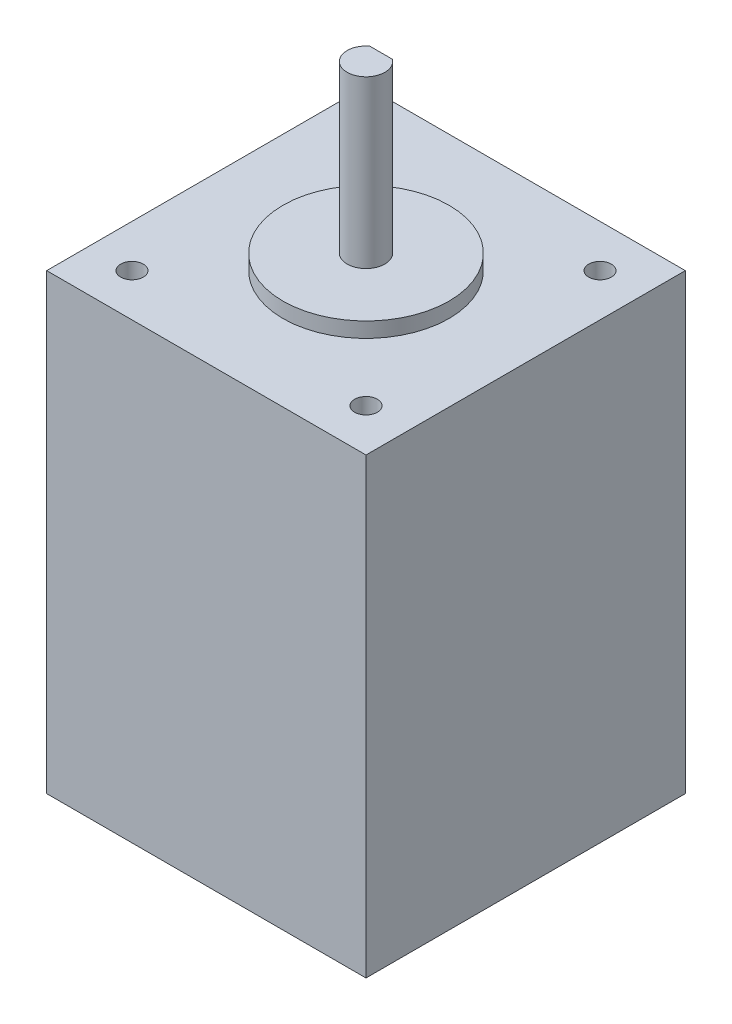
ISO-10303-21;
HEADER;
FILE_DESCRIPTION(('STEP AP214'),'2;1');
FILE_NAME('part.step','',(''),(''),'','','');
FILE_SCHEMA(('AUTOMOTIVE_DESIGN { 1 0 10303 214 1 1 1 1 }'));
ENDSEC;
DATA;
#1=APPLICATION_CONTEXT('core data for automotive mechanical design processes');
#2=APPLICATION_PROTOCOL_DEFINITION('international standard','automotive_design',2000,#1);
#3=PRODUCT_CONTEXT('',#1,'mechanical');
#4=PRODUCT('Part','Part','',(#3));
#5=PRODUCT_RELATED_PRODUCT_CATEGORY('part','',(#4));
#6=PRODUCT_DEFINITION_FORMATION('','',#4);
#7=PRODUCT_DEFINITION_CONTEXT('part definition',#1,'design');
#8=PRODUCT_DEFINITION('design','',#6,#7);
#9=PRODUCT_DEFINITION_SHAPE('','',#8);
#10=(LENGTH_UNIT() NAMED_UNIT(*) SI_UNIT(.MILLI.,.METRE.));
#11=(NAMED_UNIT(*) PLANE_ANGLE_UNIT() SI_UNIT($,.RADIAN.));
#12=(NAMED_UNIT(*) SI_UNIT($,.STERADIAN.) SOLID_ANGLE_UNIT());
#13=UNCERTAINTY_MEASURE_WITH_UNIT(LENGTH_MEASURE(1.E-05),#10,'distance_accuracy_value','');
#14=(GEOMETRIC_REPRESENTATION_CONTEXT(3) GLOBAL_UNCERTAINTY_ASSIGNED_CONTEXT((#13)) GLOBAL_UNIT_ASSIGNED_CONTEXT((#10,
#11,#12)) REPRESENTATION_CONTEXT('',''));
#15=CARTESIAN_POINT('',(0.,0.,0.));
#16=DIRECTION('',(0.,0.,1.));
#17=DIRECTION('',(1.,0.,0.));
#18=AXIS2_PLACEMENT_3D('',#15,#16,#17);
#19=CARTESIAN_POINT('',(0.,60.,0.));
#20=DIRECTION('',(0.,-1.,0.));
#21=DIRECTION('',(0.,0.,-1.));
#22=AXIS2_PLACEMENT_3D('',#19,#20,#21);
#23=PLANE('',#22);
#24=CARTESIAN_POINT('',(21.15,60.,-21.15));
#25=DIRECTION('',(0.,-1.,0.));
#26=DIRECTION('',(0.,0.,-1.));
#27=AXIS2_PLACEMENT_3D('',#24,#25,#26);
#28=CIRCLE('',#27,11.);
#29=CARTESIAN_POINT('',(21.15,60.,-32.15));
#30=VERTEX_POINT('',#29);
#31=EDGE_CURVE('E103',#30,#30,#28,.F.);
#32=ORIENTED_EDGE('',*,*,#31,.F.);
#33=EDGE_LOOP('',(#32));
#34=FACE_BOUND('',#33,.T.);
#35=DIRECTION('',(0.,0.,1.));
#36=VECTOR('',#35,1.);
#37=CARTESIAN_POINT('',(0.,60.,0.));
#38=LINE('',#37,#36);
#39=CARTESIAN_POINT('',(0.,60.,-42.3));
#40=VERTEX_POINT('',#39);
#41=CARTESIAN_POINT('',(0.,60.,0.));
#42=VERTEX_POINT('',#41);
#43=EDGE_CURVE('E145',#40,#42,#38,.T.);
#44=ORIENTED_EDGE('',*,*,#43,.T.);
#45=DIRECTION('',(1.,0.,0.));
#46=VECTOR('',#45,1.);
#47=CARTESIAN_POINT('',(0.,60.,0.));
#48=LINE('',#47,#46);
#49=CARTESIAN_POINT('',(42.3,60.,0.));
#50=VERTEX_POINT('',#49);
#51=EDGE_CURVE('E88',#42,#50,#48,.T.);
#52=ORIENTED_EDGE('',*,*,#51,.T.);
#53=DIRECTION('',(0.,0.,-1.));
#54=VECTOR('',#53,1.);
#55=CARTESIAN_POINT('',(42.3,60.,0.));
#56=LINE('',#55,#54);
#57=CARTESIAN_POINT('',(42.3,60.,-42.3));
#58=VERTEX_POINT('',#57);
#59=EDGE_CURVE('E148',#50,#58,#56,.T.);
#60=ORIENTED_EDGE('',*,*,#59,.T.);
#61=DIRECTION('',(-1.,0.,0.));
#62=VECTOR('',#61,1.);
#63=CARTESIAN_POINT('',(0.,60.,-42.3));
#64=LINE('',#63,#62);
#65=EDGE_CURVE('E59',#58,#40,#64,.T.);
#66=ORIENTED_EDGE('',*,*,#65,.T.);
#67=EDGE_LOOP('',(#44,#52,#60,#66));
#68=FACE_BOUND('',#67,.T.);
#69=CARTESIAN_POINT('',(5.65,60.,-36.65));
#70=DIRECTION('',(0.,1.,0.));
#71=DIRECTION('',(0.,0.,1.));
#72=AXIS2_PLACEMENT_3D('',#69,#70,#71);
#73=CIRCLE('',#72,1.5);
#74=CARTESIAN_POINT('',(5.65,60.,-35.15));
#75=VERTEX_POINT('',#74);
#76=EDGE_CURVE('E139',#75,#75,#73,.T.);
#77=ORIENTED_EDGE('',*,*,#76,.F.);
#78=EDGE_LOOP('',(#77));
#79=FACE_BOUND('',#78,.T.);
#80=CARTESIAN_POINT('',(36.65,60.,-36.65));
#81=DIRECTION('',(0.,1.,0.));
#82=DIRECTION('',(0.,0.,1.));
#83=AXIS2_PLACEMENT_3D('',#80,#81,#82);
#84=CIRCLE('',#83,1.50000000000002);
#85=CARTESIAN_POINT('',(36.65,60.,-35.15));
#86=VERTEX_POINT('',#85);
#87=EDGE_CURVE('E133',#86,#86,#84,.T.);
#88=ORIENTED_EDGE('',*,*,#87,.F.);
#89=EDGE_LOOP('',(#88));
#90=FACE_BOUND('',#89,.T.);
#91=CARTESIAN_POINT('',(36.65,60.,-5.65));
#92=DIRECTION('',(0.,1.,0.));
#93=DIRECTION('',(0.,0.,1.));
#94=AXIS2_PLACEMENT_3D('',#91,#92,#93);
#95=CIRCLE('',#94,1.50000000000002);
#96=CARTESIAN_POINT('',(36.65,60.,-4.14999999999998));
#97=VERTEX_POINT('',#96);
#98=EDGE_CURVE('E127',#97,#97,#95,.T.);
#99=ORIENTED_EDGE('',*,*,#98,.F.);
#100=EDGE_LOOP('',(#99));
#101=FACE_BOUND('',#100,.T.);
#102=CARTESIAN_POINT('',(5.65,60.,-5.65));
#103=DIRECTION('',(0.,1.,0.));
#104=DIRECTION('',(0.,0.,1.));
#105=AXIS2_PLACEMENT_3D('',#102,#103,#104);
#106=CIRCLE('',#105,1.49999999999999);
#107=CARTESIAN_POINT('',(5.65,60.,-4.15));
#108=VERTEX_POINT('',#107);
#109=EDGE_CURVE('E121',#108,#108,#106,.T.);
#110=ORIENTED_EDGE('',*,*,#109,.F.);
#111=EDGE_LOOP('',(#110));
#112=FACE_BOUND('',#111,.T.);
#113=ADVANCED_FACE('F35',(#34,#68,#79,#90,#101,#112),#23,.F.);
#114=CARTESIAN_POINT('',(0.,0.,0.));
#115=DIRECTION('',(0.,-1.,0.));
#116=DIRECTION('',(0.,0.,-1.));
#117=AXIS2_PLACEMENT_3D('',#114,#115,#116);
#118=PLANE('',#117);
#119=CARTESIAN_POINT('',(36.65,0.,-5.65));
#120=DIRECTION('',(0.,1.,0.));
#121=DIRECTION('',(0.,0.,1.));
#122=AXIS2_PLACEMENT_3D('',#119,#120,#121);
#123=CIRCLE('',#122,1.50000000000002);
#124=CARTESIAN_POINT('',(36.65,0.,-4.14999999999998));
#125=VERTEX_POINT('',#124);
#126=EDGE_CURVE('E124',#125,#125,#123,.T.);
#127=ORIENTED_EDGE('',*,*,#126,.T.);
#128=EDGE_LOOP('',(#127));
#129=FACE_BOUND('',#128,.T.);
#130=CARTESIAN_POINT('',(5.65,0.,-36.65));
#131=DIRECTION('',(0.,1.,0.));
#132=DIRECTION('',(0.,0.,1.));
#133=AXIS2_PLACEMENT_3D('',#130,#131,#132);
#134=CIRCLE('',#133,1.5);
#135=CARTESIAN_POINT('',(5.65,0.,-35.15));
#136=VERTEX_POINT('',#135);
#137=EDGE_CURVE('E136',#136,#136,#134,.T.);
#138=ORIENTED_EDGE('',*,*,#137,.T.);
#139=EDGE_LOOP('',(#138));
#140=FACE_BOUND('',#139,.T.);
#141=DIRECTION('',(0.,0.,1.));
#142=VECTOR('',#141,1.);
#143=CARTESIAN_POINT('',(0.,0.,0.));
#144=LINE('',#143,#142);
#145=CARTESIAN_POINT('',(0.,0.,-42.3));
#146=VERTEX_POINT('',#145);
#147=CARTESIAN_POINT('',(0.,0.,0.));
#148=VERTEX_POINT('',#147);
#149=EDGE_CURVE('E142',#146,#148,#144,.T.);
#150=ORIENTED_EDGE('',*,*,#149,.F.);
#151=DIRECTION('',(-1.,0.,0.));
#152=VECTOR('',#151,1.);
#153=CARTESIAN_POINT('',(0.,0.,-42.3));
#154=LINE('',#153,#152);
#155=CARTESIAN_POINT('',(42.3,0.,-42.3));
#156=VERTEX_POINT('',#155);
#157=EDGE_CURVE('E80',#156,#146,#154,.T.);
#158=ORIENTED_EDGE('',*,*,#157,.F.);
#159=DIRECTION('',(0.,0.,-1.));
#160=VECTOR('',#159,1.);
#161=CARTESIAN_POINT('',(42.3,0.,0.));
#162=LINE('',#161,#160);
#163=CARTESIAN_POINT('',(42.3,0.,0.));
#164=VERTEX_POINT('',#163);
#165=EDGE_CURVE('E156',#164,#156,#162,.T.);
#166=ORIENTED_EDGE('',*,*,#165,.F.);
#167=DIRECTION('',(1.,0.,0.));
#168=VECTOR('',#167,1.);
#169=CARTESIAN_POINT('',(0.,0.,0.));
#170=LINE('',#169,#168);
#171=EDGE_CURVE('E154',#148,#164,#170,.T.);
#172=ORIENTED_EDGE('',*,*,#171,.F.);
#173=EDGE_LOOP('',(#150,#158,#166,#172));
#174=FACE_BOUND('',#173,.T.);
#175=CARTESIAN_POINT('',(36.65,0.,-36.65));
#176=DIRECTION('',(0.,1.,0.));
#177=DIRECTION('',(0.,0.,1.));
#178=AXIS2_PLACEMENT_3D('',#175,#176,#177);
#179=CIRCLE('',#178,1.50000000000002);
#180=CARTESIAN_POINT('',(36.65,0.,-35.15));
#181=VERTEX_POINT('',#180);
#182=EDGE_CURVE('E130',#181,#181,#179,.T.);
#183=ORIENTED_EDGE('',*,*,#182,.T.);
#184=EDGE_LOOP('',(#183));
#185=FACE_BOUND('',#184,.T.);
#186=CARTESIAN_POINT('',(5.65,0.,-5.65));
#187=DIRECTION('',(0.,1.,0.));
#188=DIRECTION('',(0.,0.,1.));
#189=AXIS2_PLACEMENT_3D('',#186,#187,#188);
#190=CIRCLE('',#189,1.49999999999999);
#191=CARTESIAN_POINT('',(5.65,0.,-4.15));
#192=VERTEX_POINT('',#191);
#193=EDGE_CURVE('E115',#192,#192,#190,.T.);
#194=ORIENTED_EDGE('',*,*,#193,.T.);
#195=EDGE_LOOP('',(#194));
#196=FACE_BOUND('',#195,.T.);
#197=ADVANCED_FACE('F173',(#129,#140,#174,#185,#196),#118,.T.);
#198=CARTESIAN_POINT('',(0.,60.,0.));
#199=DIRECTION('',(1.,0.,0.));
#200=DIRECTION('',(0.,0.,-1.));
#201=AXIS2_PLACEMENT_3D('',#198,#199,#200);
#202=PLANE('',#201);
#203=ORIENTED_EDGE('',*,*,#149,.T.);
#204=DIRECTION('',(0.,-1.,0.));
#205=VECTOR('',#204,1.);
#206=CARTESIAN_POINT('',(0.,60.,0.));
#207=LINE('',#206,#205);
#208=EDGE_CURVE('E165',#42,#148,#207,.T.);
#209=ORIENTED_EDGE('',*,*,#208,.F.);
#210=ORIENTED_EDGE('',*,*,#43,.F.);
#211=DIRECTION('',(0.,-1.,0.));
#212=VECTOR('',#211,1.);
#213=CARTESIAN_POINT('',(0.,60.,-42.3));
#214=LINE('',#213,#212);
#215=EDGE_CURVE('E151',#40,#146,#214,.T.);
#216=ORIENTED_EDGE('',*,*,#215,.T.);
#217=EDGE_LOOP('',(#203,#209,#210,#216));
#218=FACE_BOUND('',#217,.T.);
#219=ADVANCED_FACE('F37',(#218),#202,.F.);
#220=CARTESIAN_POINT('',(0.,60.,0.));
#221=DIRECTION('',(0.,0.,-1.));
#222=DIRECTION('',(-1.,0.,0.));
#223=AXIS2_PLACEMENT_3D('',#220,#221,#222);
#224=PLANE('',#223);
#225=ORIENTED_EDGE('',*,*,#171,.T.);
#226=DIRECTION('',(0.,-1.,0.));
#227=VECTOR('',#226,1.);
#228=CARTESIAN_POINT('',(42.3,60.,0.));
#229=LINE('',#228,#227);
#230=EDGE_CURVE('E162',#50,#164,#229,.T.);
#231=ORIENTED_EDGE('',*,*,#230,.F.);
#232=ORIENTED_EDGE('',*,*,#51,.F.);
#233=ORIENTED_EDGE('',*,*,#208,.T.);
#234=EDGE_LOOP('',(#225,#231,#232,#233));
#235=FACE_BOUND('',#234,.T.);
#236=ADVANCED_FACE('F199',(#235),#224,.F.);
#237=CARTESIAN_POINT('',(42.3,60.,0.));
#238=DIRECTION('',(-1.,0.,0.));
#239=DIRECTION('',(0.,0.,1.));
#240=AXIS2_PLACEMENT_3D('',#237,#238,#239);
#241=PLANE('',#240);
#242=ORIENTED_EDGE('',*,*,#165,.T.);
#243=DIRECTION('',(0.,-1.,0.));
#244=VECTOR('',#243,1.);
#245=CARTESIAN_POINT('',(42.3,60.,-42.3));
#246=LINE('',#245,#244);
#247=EDGE_CURVE('E160',#58,#156,#246,.T.);
#248=ORIENTED_EDGE('',*,*,#247,.F.);
#249=ORIENTED_EDGE('',*,*,#59,.F.);
#250=ORIENTED_EDGE('',*,*,#230,.T.);
#251=EDGE_LOOP('',(#242,#248,#249,#250));
#252=FACE_BOUND('',#251,.T.);
#253=ADVANCED_FACE('F208',(#252),#241,.F.);
#254=CARTESIAN_POINT('',(0.,60.,-42.3));
#255=DIRECTION('',(0.,0.,1.));
#256=DIRECTION('',(1.,0.,0.));
#257=AXIS2_PLACEMENT_3D('',#254,#255,#256);
#258=PLANE('',#257);
#259=ORIENTED_EDGE('',*,*,#157,.T.);
#260=ORIENTED_EDGE('',*,*,#215,.F.);
#261=ORIENTED_EDGE('',*,*,#65,.F.);
#262=ORIENTED_EDGE('',*,*,#247,.T.);
#263=EDGE_LOOP('',(#259,#260,#261,#262));
#264=FACE_BOUND('',#263,.T.);
#265=ADVANCED_FACE('F204',(#264),#258,.F.);
#266=CARTESIAN_POINT('',(5.65,60.,-36.65));
#267=DIRECTION('',(0.,-1.,0.));
#268=DIRECTION('',(0.,0.,-1.));
#269=AXIS2_PLACEMENT_3D('',#266,#267,#268);
#270=CYLINDRICAL_SURFACE('',#269,1.5);
#271=ORIENTED_EDGE('',*,*,#76,.T.);
#272=EDGE_LOOP('',(#271));
#273=FACE_BOUND('',#272,.T.);
#274=ORIENTED_EDGE('',*,*,#137,.F.);
#275=EDGE_LOOP('',(#274));
#276=FACE_BOUND('',#275,.T.);
#277=ADVANCED_FACE('F207',(#273,#276),#270,.F.);
#278=CARTESIAN_POINT('',(36.65,60.,-36.65));
#279=DIRECTION('',(0.,-1.,0.));
#280=DIRECTION('',(0.,0.,-1.));
#281=AXIS2_PLACEMENT_3D('',#278,#279,#280);
#282=CYLINDRICAL_SURFACE('',#281,1.50000000000002);
#283=ORIENTED_EDGE('',*,*,#87,.T.);
#284=EDGE_LOOP('',(#283));
#285=FACE_BOUND('',#284,.T.);
#286=ORIENTED_EDGE('',*,*,#182,.F.);
#287=EDGE_LOOP('',(#286));
#288=FACE_BOUND('',#287,.T.);
#289=ADVANCED_FACE('F222',(#285,#288),#282,.F.);
#290=CARTESIAN_POINT('',(36.65,60.,-5.65));
#291=DIRECTION('',(0.,-1.,0.));
#292=DIRECTION('',(0.,0.,-1.));
#293=AXIS2_PLACEMENT_3D('',#290,#291,#292);
#294=CYLINDRICAL_SURFACE('',#293,1.50000000000002);
#295=ORIENTED_EDGE('',*,*,#98,.T.);
#296=EDGE_LOOP('',(#295));
#297=FACE_BOUND('',#296,.T.);
#298=ORIENTED_EDGE('',*,*,#126,.F.);
#299=EDGE_LOOP('',(#298));
#300=FACE_BOUND('',#299,.T.);
#301=ADVANCED_FACE('F189',(#297,#300),#294,.F.);
#302=CARTESIAN_POINT('',(5.65,60.,-5.65));
#303=DIRECTION('',(0.,-1.,0.));
#304=DIRECTION('',(0.,0.,-1.));
#305=AXIS2_PLACEMENT_3D('',#302,#303,#304);
#306=CYLINDRICAL_SURFACE('',#305,1.49999999999999);
#307=ORIENTED_EDGE('',*,*,#109,.T.);
#308=EDGE_LOOP('',(#307));
#309=FACE_BOUND('',#308,.T.);
#310=ORIENTED_EDGE('',*,*,#193,.F.);
#311=EDGE_LOOP('',(#310));
#312=FACE_BOUND('',#311,.T.);
#313=ADVANCED_FACE('F186',(#309,#312),#306,.F.);
#314=CARTESIAN_POINT('',(21.15,62.,-21.15));
#315=DIRECTION('',(0.,-1.,0.));
#316=DIRECTION('',(0.,0.,-1.));
#317=AXIS2_PLACEMENT_3D('',#314,#315,#316);
#318=CYLINDRICAL_SURFACE('',#317,11.);
#319=CARTESIAN_POINT('',(21.15,62.,-21.15));
#320=DIRECTION('',(0.,1.,0.));
#321=DIRECTION('',(0.,0.,1.));
#322=AXIS2_PLACEMENT_3D('',#319,#320,#321);
#323=CIRCLE('',#322,11.);
#324=CARTESIAN_POINT('',(21.15,62.,-10.15));
#325=VERTEX_POINT('',#324);
#326=EDGE_CURVE('E111',#325,#325,#323,.T.);
#327=ORIENTED_EDGE('',*,*,#326,.F.);
#328=EDGE_LOOP('',(#327));
#329=FACE_BOUND('',#328,.T.);
#330=ORIENTED_EDGE('',*,*,#31,.T.);
#331=EDGE_LOOP('',(#330));
#332=FACE_BOUND('',#331,.T.);
#333=ADVANCED_FACE('F170',(#329,#332),#318,.T.);
#334=CARTESIAN_POINT('',(21.15,62.,-21.15));
#335=DIRECTION('',(0.,1.,0.));
#336=DIRECTION('',(0.,0.,1.));
#337=AXIS2_PLACEMENT_3D('',#334,#335,#336);
#338=PLANE('',#337);
#339=CARTESIAN_POINT('',(21.15,62.,-21.15));
#340=DIRECTION('',(0.,1.,0.));
#341=DIRECTION('',(0.,0.,1.));
#342=AXIS2_PLACEMENT_3D('',#339,#340,#341);
#343=CIRCLE('',#342,2.5);
#344=CARTESIAN_POINT('',(21.15,62.,-18.65));
#345=VERTEX_POINT('',#344);
#346=EDGE_CURVE('E112',#345,#345,#343,.T.);
#347=ORIENTED_EDGE('',*,*,#346,.F.);
#348=EDGE_LOOP('',(#347));
#349=FACE_BOUND('',#348,.T.);
#350=ORIENTED_EDGE('',*,*,#326,.T.);
#351=EDGE_LOOP('',(#350));
#352=FACE_BOUND('',#351,.T.);
#353=ADVANCED_FACE('F236',(#349,#352),#338,.T.);
#354=CARTESIAN_POINT('',(21.15,84.,-21.15));
#355=DIRECTION('',(0.,-1.,0.));
#356=DIRECTION('',(0.,0.,-1.));
#357=AXIS2_PLACEMENT_3D('',#354,#355,#356);
#358=CYLINDRICAL_SURFACE('',#357,2.5);
#359=CARTESIAN_POINT('',(21.15,84.,-21.15));
#360=DIRECTION('',(0.,1.,0.));
#361=DIRECTION('',(0.,0.,1.));
#362=AXIS2_PLACEMENT_3D('',#359,#360,#361);
#363=CIRCLE('',#362,2.5);
#364=CARTESIAN_POINT('',(19.65,84.,-23.15));
#365=VERTEX_POINT('',#364);
#366=CARTESIAN_POINT('',(22.65,84.,-23.15));
#367=VERTEX_POINT('',#366);
#368=EDGE_CURVE('E107',#365,#367,#363,.T.);
#369=ORIENTED_EDGE('',*,*,#368,.F.);
#370=DIRECTION('',(0.,-1.,0.));
#371=VECTOR('',#370,1.);
#372=CARTESIAN_POINT('',(19.65,84.,-23.15));
#373=LINE('',#372,#371);
#374=CARTESIAN_POINT('',(19.65,64.,-23.15));
#375=VERTEX_POINT('',#374);
#376=EDGE_CURVE('E50',#365,#375,#373,.T.);
#377=ORIENTED_EDGE('',*,*,#376,.T.);
#378=CARTESIAN_POINT('',(21.15,64.,-21.15));
#379=DIRECTION('',(0.,1.,0.));
#380=DIRECTION('',(0.,0.,1.));
#381=AXIS2_PLACEMENT_3D('',#378,#379,#380);
#382=CIRCLE('',#381,2.5);
#383=CARTESIAN_POINT('',(22.65,64.,-23.15));
#384=VERTEX_POINT('',#383);
#385=EDGE_CURVE('E11',#384,#375,#382,.T.);
#386=ORIENTED_EDGE('',*,*,#385,.F.);
#387=DIRECTION('',(0.,-1.,0.));
#388=VECTOR('',#387,1.);
#389=CARTESIAN_POINT('',(22.65,84.,-23.15));
#390=LINE('',#389,#388);
#391=EDGE_CURVE('E98',#384,#367,#390,.F.);
#392=ORIENTED_EDGE('',*,*,#391,.T.);
#393=EDGE_LOOP('',(#369,#377,#386,#392));
#394=FACE_BOUND('',#393,.T.);
#395=ORIENTED_EDGE('',*,*,#346,.T.);
#396=EDGE_LOOP('',(#395));
#397=FACE_BOUND('',#396,.T.);
#398=ADVANCED_FACE('F105',(#394,#397),#358,.T.);
#399=CARTESIAN_POINT('',(21.15,84.,-21.15));
#400=DIRECTION('',(0.,1.,0.));
#401=DIRECTION('',(0.,0.,1.));
#402=AXIS2_PLACEMENT_3D('',#399,#400,#401);
#403=PLANE('',#402);
#404=DIRECTION('',(1.,0.,0.));
#405=VECTOR('',#404,1.);
#406=CARTESIAN_POINT('',(21.15,84.,-23.15));
#407=LINE('',#406,#405);
#408=EDGE_CURVE('E43',#365,#367,#407,.T.);
#409=ORIENTED_EDGE('',*,*,#408,.F.);
#410=ORIENTED_EDGE('',*,*,#368,.T.);
#411=EDGE_LOOP('',(#409,#410));
#412=FACE_BOUND('',#411,.T.);
#413=ADVANCED_FACE('F110',(#412),#403,.T.);
#414=CARTESIAN_POINT('',(0.,64.,0.));
#415=DIRECTION('',(0.,1.,0.));
#416=DIRECTION('',(0.,0.,1.));
#417=AXIS2_PLACEMENT_3D('',#414,#415,#416);
#418=PLANE('',#417);
#419=DIRECTION('',(1.,0.,0.));
#420=VECTOR('',#419,1.);
#421=CARTESIAN_POINT('',(18.65,64.,-23.15));
#422=LINE('',#421,#420);
#423=EDGE_CURVE('E108',#375,#384,#422,.T.);
#424=ORIENTED_EDGE('',*,*,#423,.T.);
#425=ORIENTED_EDGE('',*,*,#385,.T.);
#426=EDGE_LOOP('',(#424,#425));
#427=FACE_BOUND('',#426,.T.);
#428=ADVANCED_FACE('F245',(#427),#418,.T.);
#429=CARTESIAN_POINT('',(18.65,64.,-23.15));
#430=DIRECTION('',(0.,0.,1.));
#431=DIRECTION('',(1.,0.,0.));
#432=AXIS2_PLACEMENT_3D('',#429,#430,#431);
#433=PLANE('',#432);
#434=ORIENTED_EDGE('',*,*,#408,.T.);
#435=ORIENTED_EDGE('',*,*,#391,.F.);
#436=ORIENTED_EDGE('',*,*,#423,.F.);
#437=ORIENTED_EDGE('',*,*,#376,.F.);
#438=EDGE_LOOP('',(#434,#435,#436,#437));
#439=FACE_BOUND('',#438,.T.);
#440=ADVANCED_FACE('F97',(#439),#433,.F.);
#441=CLOSED_SHELL('',(#113,#197,#219,#236,#253,#265,#277,#289,#301,#313,#333,#353,#398,#413,
#428,#440));
#442=MANIFOLD_SOLID_BREP('B2',#441);
#443=ADVANCED_BREP_SHAPE_REPRESENTATION('',(#18,#442),#14);
#444=SHAPE_DEFINITION_REPRESENTATION(#9,#443);
ENDSEC;
END-ISO-10303-21;
